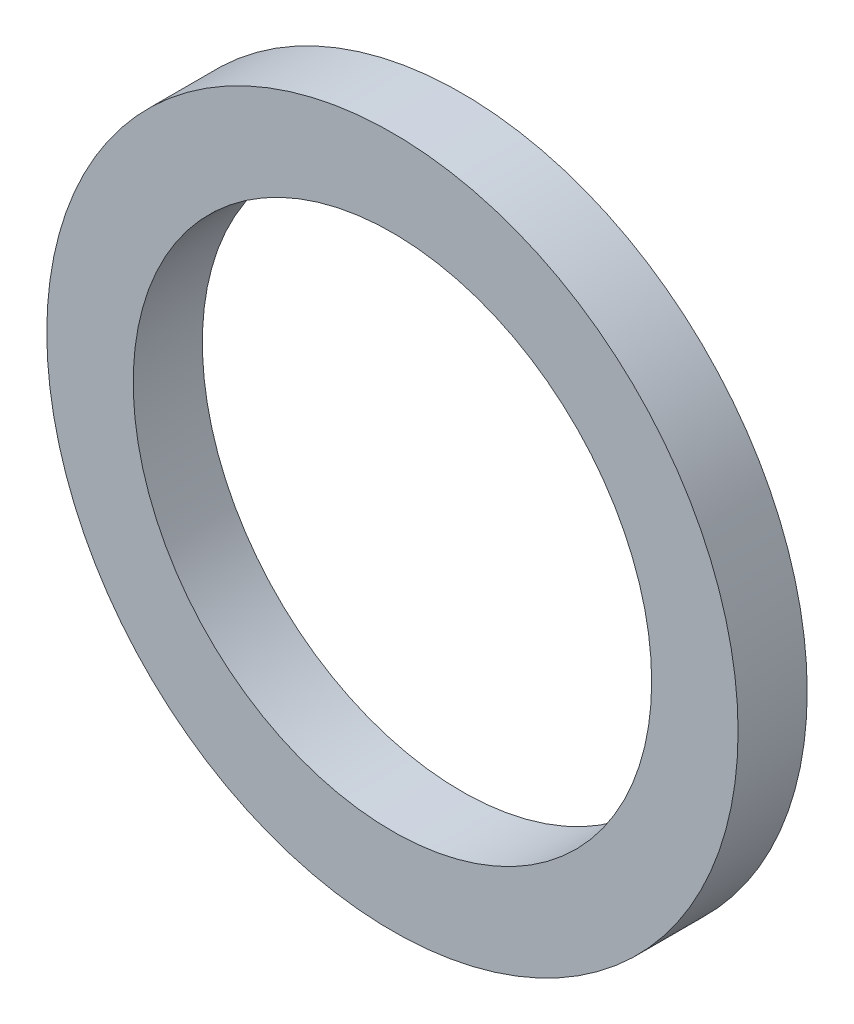
ISO-10303-21;
HEADER;
FILE_DESCRIPTION(('STEP AP214'),'2;1');
FILE_NAME('part.step','',(''),(''),'','','');
FILE_SCHEMA(('AUTOMOTIVE_DESIGN { 1 0 10303 214 1 1 1 1 }'));
ENDSEC;
DATA;
#1=APPLICATION_CONTEXT('core data for automotive mechanical design processes');
#2=APPLICATION_PROTOCOL_DEFINITION('international standard','automotive_design',2000,#1);
#3=PRODUCT_CONTEXT('',#1,'mechanical');
#4=PRODUCT('Part','Part','',(#3));
#5=PRODUCT_RELATED_PRODUCT_CATEGORY('part','',(#4));
#6=PRODUCT_DEFINITION_FORMATION('','',#4);
#7=PRODUCT_DEFINITION_CONTEXT('part definition',#1,'design');
#8=PRODUCT_DEFINITION('design','',#6,#7);
#9=PRODUCT_DEFINITION_SHAPE('','',#8);
#10=(LENGTH_UNIT() NAMED_UNIT(*) SI_UNIT(.MILLI.,.METRE.));
#11=(NAMED_UNIT(*) PLANE_ANGLE_UNIT() SI_UNIT($,.RADIAN.));
#12=(NAMED_UNIT(*) SI_UNIT($,.STERADIAN.) SOLID_ANGLE_UNIT());
#13=UNCERTAINTY_MEASURE_WITH_UNIT(LENGTH_MEASURE(1.E-05),#10,'distance_accuracy_value','');
#14=(GEOMETRIC_REPRESENTATION_CONTEXT(3) GLOBAL_UNCERTAINTY_ASSIGNED_CONTEXT((#13)) GLOBAL_UNIT_ASSIGNED_CONTEXT((#10,
#11,#12)) REPRESENTATION_CONTEXT('',''));
#15=CARTESIAN_POINT('',(0.,0.,0.));
#16=DIRECTION('',(0.,0.,1.));
#17=DIRECTION('',(1.,0.,0.));
#18=AXIS2_PLACEMENT_3D('',#15,#16,#17);
#19=CARTESIAN_POINT('',(0.,0.,0.8));
#20=DIRECTION('',(0.,0.,1.));
#21=DIRECTION('',(1.,0.,0.));
#22=AXIS2_PLACEMENT_3D('',#19,#20,#21);
#23=PLANE('',#22);
#24=CARTESIAN_POINT('',(0.,0.,0.8));
#25=DIRECTION('',(0.,0.,1.));
#26=DIRECTION('',(1.,0.,0.));
#27=AXIS2_PLACEMENT_3D('',#24,#25,#26);
#28=CIRCLE('',#27,4.);
#29=CARTESIAN_POINT('',(4.,0.,0.8));
#30=VERTEX_POINT('',#29);
#31=EDGE_CURVE('E10',#30,#30,#28,.T.);
#32=ORIENTED_EDGE('',*,*,#31,.T.);
#33=EDGE_LOOP('',(#32));
#34=FACE_BOUND('',#33,.T.);
#35=CARTESIAN_POINT('',(0.,0.,0.8));
#36=DIRECTION('',(0.,0.,1.));
#37=DIRECTION('',(1.,0.,0.));
#38=AXIS2_PLACEMENT_3D('',#35,#36,#37);
#39=CIRCLE('',#38,3.);
#40=CARTESIAN_POINT('',(3.,0.,0.8));
#41=VERTEX_POINT('',#40);
#42=EDGE_CURVE('E41',#41,#41,#39,.T.);
#43=ORIENTED_EDGE('',*,*,#42,.F.);
#44=EDGE_LOOP('',(#43));
#45=FACE_BOUND('',#44,.T.);
#46=ADVANCED_FACE('F30',(#34,#45),#23,.T.);
#47=CARTESIAN_POINT('',(0.,0.,0.));
#48=DIRECTION('',(0.,0.,1.));
#49=DIRECTION('',(1.,0.,0.));
#50=AXIS2_PLACEMENT_3D('',#47,#48,#49);
#51=PLANE('',#50);
#52=CARTESIAN_POINT('',(0.,0.,0.));
#53=DIRECTION('',(0.,0.,1.));
#54=DIRECTION('',(1.,0.,0.));
#55=AXIS2_PLACEMENT_3D('',#52,#53,#54);
#56=CIRCLE('',#55,4.);
#57=CARTESIAN_POINT('',(4.,0.,0.));
#58=VERTEX_POINT('',#57);
#59=EDGE_CURVE('E34',#58,#58,#56,.T.);
#60=ORIENTED_EDGE('',*,*,#59,.F.);
#61=EDGE_LOOP('',(#60));
#62=FACE_BOUND('',#61,.T.);
#63=CARTESIAN_POINT('',(0.,0.,0.));
#64=DIRECTION('',(0.,0.,1.));
#65=DIRECTION('',(1.,0.,0.));
#66=AXIS2_PLACEMENT_3D('',#63,#64,#65);
#67=CIRCLE('',#66,3.);
#68=CARTESIAN_POINT('',(3.,0.,0.));
#69=VERTEX_POINT('',#68);
#70=EDGE_CURVE('E43',#69,#69,#67,.T.);
#71=ORIENTED_EDGE('',*,*,#70,.T.);
#72=EDGE_LOOP('',(#71));
#73=FACE_BOUND('',#72,.T.);
#74=ADVANCED_FACE('F53',(#62,#73),#51,.F.);
#75=CARTESIAN_POINT('',(0.,0.,0.8));
#76=DIRECTION('',(0.,0.,-1.));
#77=DIRECTION('',(-1.,0.,0.));
#78=AXIS2_PLACEMENT_3D('',#75,#76,#77);
#79=CYLINDRICAL_SURFACE('',#78,4.);
#80=ORIENTED_EDGE('',*,*,#31,.F.);
#81=EDGE_LOOP('',(#80));
#82=FACE_BOUND('',#81,.T.);
#83=ORIENTED_EDGE('',*,*,#59,.T.);
#84=EDGE_LOOP('',(#83));
#85=FACE_BOUND('',#84,.T.);
#86=ADVANCED_FACE('F32',(#82,#85),#79,.T.);
#87=CARTESIAN_POINT('',(0.,0.,0.8));
#88=DIRECTION('',(0.,0.,-1.));
#89=DIRECTION('',(-1.,0.,0.));
#90=AXIS2_PLACEMENT_3D('',#87,#88,#89);
#91=CYLINDRICAL_SURFACE('',#90,3.);
#92=ORIENTED_EDGE('',*,*,#42,.T.);
#93=EDGE_LOOP('',(#92));
#94=FACE_BOUND('',#93,.T.);
#95=ORIENTED_EDGE('',*,*,#70,.F.);
#96=EDGE_LOOP('',(#95));
#97=FACE_BOUND('',#96,.T.);
#98=ADVANCED_FACE('F49',(#94,#97),#91,.F.);
#99=CLOSED_SHELL('',(#46,#74,#86,#98));
#100=MANIFOLD_SOLID_BREP('B2',#99);
#101=ADVANCED_BREP_SHAPE_REPRESENTATION('',(#18,#100),#14);
#102=SHAPE_DEFINITION_REPRESENTATION(#9,#101);
ENDSEC;
END-ISO-10303-21;
